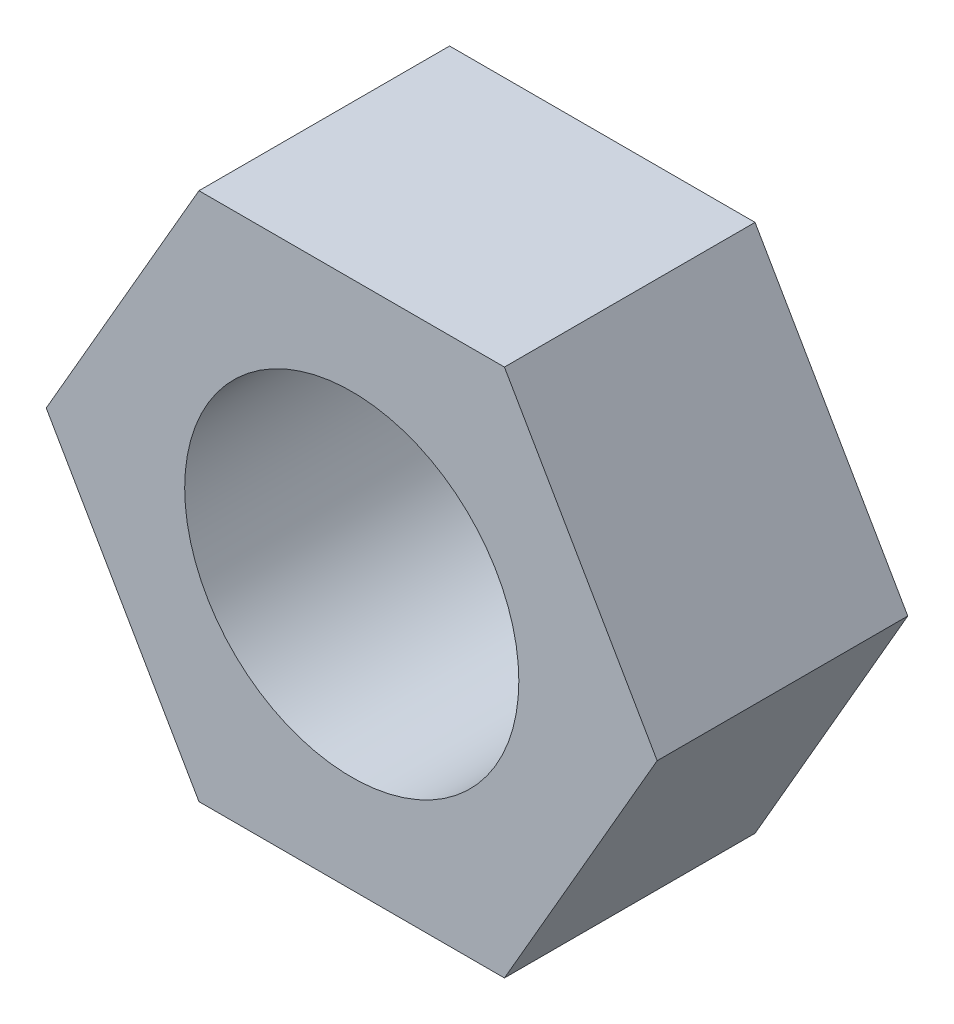
ISO-10303-21;
HEADER;
FILE_DESCRIPTION(('STEP AP214'),'2;1');
FILE_NAME('part.step','',(''),(''),'','','');
FILE_SCHEMA(('AUTOMOTIVE_DESIGN { 1 0 10303 214 1 1 1 1 }'));
ENDSEC;
DATA;
#1=APPLICATION_CONTEXT('core data for automotive mechanical design processes');
#2=APPLICATION_PROTOCOL_DEFINITION('international standard','automotive_design',2000,#1);
#3=PRODUCT_CONTEXT('',#1,'mechanical');
#4=PRODUCT('Part','Part','',(#3));
#5=PRODUCT_RELATED_PRODUCT_CATEGORY('part','',(#4));
#6=PRODUCT_DEFINITION_FORMATION('','',#4);
#7=PRODUCT_DEFINITION_CONTEXT('part definition',#1,'design');
#8=PRODUCT_DEFINITION('design','',#6,#7);
#9=PRODUCT_DEFINITION_SHAPE('','',#8);
#10=(LENGTH_UNIT() NAMED_UNIT(*) SI_UNIT(.MILLI.,.METRE.));
#11=(NAMED_UNIT(*) PLANE_ANGLE_UNIT() SI_UNIT($,.RADIAN.));
#12=(NAMED_UNIT(*) SI_UNIT($,.STERADIAN.) SOLID_ANGLE_UNIT());
#13=UNCERTAINTY_MEASURE_WITH_UNIT(LENGTH_MEASURE(1.E-05),#10,'distance_accuracy_value','');
#14=(GEOMETRIC_REPRESENTATION_CONTEXT(3) GLOBAL_UNCERTAINTY_ASSIGNED_CONTEXT((#13)) GLOBAL_UNIT_ASSIGNED_CONTEXT((#10,
#11,#12)) REPRESENTATION_CONTEXT('',''));
#15=CARTESIAN_POINT('',(0.,0.,0.));
#16=DIRECTION('',(0.,0.,1.));
#17=DIRECTION('',(1.,0.,0.));
#18=AXIS2_PLACEMENT_3D('',#15,#16,#17);
#19=CARTESIAN_POINT('',(-10.9696551146029,0.,9.));
#20=DIRECTION('',(0.866025403784438,0.500000000000001,0.));
#21=DIRECTION('',(-0.500000000000001,0.866025403784438,0.));
#22=AXIS2_PLACEMENT_3D('',#19,#20,#21);
#23=PLANE('',#22);
#24=DIRECTION('',(0.500000000000001,-0.866025403784438,0.));
#25=VECTOR('',#24,1.);
#26=CARTESIAN_POINT('',(-10.9696551146029,0.,0.));
#27=LINE('',#26,#25);
#28=CARTESIAN_POINT('',(-10.9696551146029,0.,0.));
#29=VERTEX_POINT('',#28);
#30=CARTESIAN_POINT('',(-5.48482755730144,-9.5,0.));
#31=VERTEX_POINT('',#30);
#32=EDGE_CURVE('E87',#29,#31,#27,.T.);
#33=ORIENTED_EDGE('',*,*,#32,.T.);
#34=DIRECTION('',(0.,0.,-1.));
#35=VECTOR('',#34,1.);
#36=CARTESIAN_POINT('',(-5.48482755730144,-9.5,9.));
#37=LINE('',#36,#35);
#38=CARTESIAN_POINT('',(-5.48482755730144,-9.5,9.));
#39=VERTEX_POINT('',#38);
#40=EDGE_CURVE('E11',#39,#31,#37,.T.);
#41=ORIENTED_EDGE('',*,*,#40,.F.);
#42=DIRECTION('',(0.500000000000001,-0.866025403784438,0.));
#43=VECTOR('',#42,1.);
#44=CARTESIAN_POINT('',(-10.9696551146029,0.,9.));
#45=LINE('',#44,#43);
#46=CARTESIAN_POINT('',(-10.9696551146029,0.,9.));
#47=VERTEX_POINT('',#46);
#48=EDGE_CURVE('E113',#47,#39,#45,.T.);
#49=ORIENTED_EDGE('',*,*,#48,.F.);
#50=DIRECTION('',(0.,0.,-1.));
#51=VECTOR('',#50,1.);
#52=CARTESIAN_POINT('',(-10.9696551146029,0.,9.));
#53=LINE('',#52,#51);
#54=EDGE_CURVE('E100',#47,#29,#53,.T.);
#55=ORIENTED_EDGE('',*,*,#54,.T.);
#56=EDGE_LOOP('',(#33,#41,#49,#55));
#57=FACE_BOUND('',#56,.T.);
#58=ADVANCED_FACE('F30',(#57),#23,.F.);
#59=CARTESIAN_POINT('',(5.48482755730145,-9.5,9.));
#60=DIRECTION('',(0.,1.,0.));
#61=DIRECTION('',(0.,0.,1.));
#62=AXIS2_PLACEMENT_3D('',#59,#60,#61);
#63=PLANE('',#62);
#64=DIRECTION('',(1.,0.,0.));
#65=VECTOR('',#64,1.);
#66=CARTESIAN_POINT('',(5.48482755730145,-9.5,0.));
#67=LINE('',#66,#65);
#68=CARTESIAN_POINT('',(5.48482755730145,-9.5,0.));
#69=VERTEX_POINT('',#68);
#70=EDGE_CURVE('E83',#31,#69,#67,.T.);
#71=ORIENTED_EDGE('',*,*,#70,.T.);
#72=DIRECTION('',(0.,0.,-1.));
#73=VECTOR('',#72,1.);
#74=CARTESIAN_POINT('',(5.48482755730145,-9.5,9.));
#75=LINE('',#74,#73);
#76=CARTESIAN_POINT('',(5.48482755730145,-9.5,9.));
#77=VERTEX_POINT('',#76);
#78=EDGE_CURVE('E38',#77,#69,#75,.T.);
#79=ORIENTED_EDGE('',*,*,#78,.F.);
#80=DIRECTION('',(1.,0.,0.));
#81=VECTOR('',#80,1.);
#82=CARTESIAN_POINT('',(5.48482755730145,-9.5,9.));
#83=LINE('',#82,#81);
#84=EDGE_CURVE('E96',#39,#77,#83,.T.);
#85=ORIENTED_EDGE('',*,*,#84,.F.);
#86=ORIENTED_EDGE('',*,*,#40,.T.);
#87=EDGE_LOOP('',(#71,#79,#85,#86));
#88=FACE_BOUND('',#87,.T.);
#89=ADVANCED_FACE('F95',(#88),#63,.F.);
#90=CARTESIAN_POINT('',(5.48482755730145,-9.5,9.));
#91=DIRECTION('',(-0.866025403784439,0.5,0.));
#92=DIRECTION('',(-0.5,-0.866025403784439,0.));
#93=AXIS2_PLACEMENT_3D('',#90,#91,#92);
#94=PLANE('',#93);
#95=DIRECTION('',(0.5,0.866025403784439,0.));
#96=VECTOR('',#95,1.);
#97=CARTESIAN_POINT('',(5.48482755730145,-9.5,0.));
#98=LINE('',#97,#96);
#99=CARTESIAN_POINT('',(10.9696551146029,0.,0.));
#100=VERTEX_POINT('',#99);
#101=EDGE_CURVE('E89',#69,#100,#98,.T.);
#102=ORIENTED_EDGE('',*,*,#101,.T.);
#103=DIRECTION('',(0.,0.,-1.));
#104=VECTOR('',#103,1.);
#105=CARTESIAN_POINT('',(10.9696551146029,0.,9.));
#106=LINE('',#105,#104);
#107=CARTESIAN_POINT('',(10.9696551146029,0.,9.));
#108=VERTEX_POINT('',#107);
#109=EDGE_CURVE('E129',#108,#100,#106,.T.);
#110=ORIENTED_EDGE('',*,*,#109,.F.);
#111=DIRECTION('',(0.5,0.866025403784439,0.));
#112=VECTOR('',#111,1.);
#113=CARTESIAN_POINT('',(5.48482755730145,-9.5,9.));
#114=LINE('',#113,#112);
#115=EDGE_CURVE('E116',#77,#108,#114,.T.);
#116=ORIENTED_EDGE('',*,*,#115,.F.);
#117=ORIENTED_EDGE('',*,*,#78,.T.);
#118=EDGE_LOOP('',(#102,#110,#116,#117));
#119=FACE_BOUND('',#118,.T.);
#120=ADVANCED_FACE('F134',(#119),#94,.F.);
#121=CARTESIAN_POINT('',(10.9696551146029,0.,9.));
#122=DIRECTION('',(-0.866025403784439,-0.5,0.));
#123=DIRECTION('',(0.5,-0.866025403784439,0.));
#124=AXIS2_PLACEMENT_3D('',#121,#122,#123);
#125=PLANE('',#124);
#126=DIRECTION('',(-0.5,0.866025403784438,0.));
#127=VECTOR('',#126,1.);
#128=CARTESIAN_POINT('',(10.9696551146029,0.,0.));
#129=LINE('',#128,#127);
#130=CARTESIAN_POINT('',(5.48482755730144,9.5,0.));
#131=VERTEX_POINT('',#130);
#132=EDGE_CURVE('E107',#100,#131,#129,.T.);
#133=ORIENTED_EDGE('',*,*,#132,.T.);
#134=DIRECTION('',(0.,0.,-1.));
#135=VECTOR('',#134,1.);
#136=CARTESIAN_POINT('',(5.48482755730144,9.5,9.));
#137=LINE('',#136,#135);
#138=CARTESIAN_POINT('',(5.48482755730144,9.5,9.));
#139=VERTEX_POINT('',#138);
#140=EDGE_CURVE('E126',#139,#131,#137,.T.);
#141=ORIENTED_EDGE('',*,*,#140,.F.);
#142=DIRECTION('',(-0.5,0.866025403784438,0.));
#143=VECTOR('',#142,1.);
#144=CARTESIAN_POINT('',(10.9696551146029,0.,9.));
#145=LINE('',#144,#143);
#146=EDGE_CURVE('E118',#108,#139,#145,.T.);
#147=ORIENTED_EDGE('',*,*,#146,.F.);
#148=ORIENTED_EDGE('',*,*,#109,.T.);
#149=EDGE_LOOP('',(#133,#141,#147,#148));
#150=FACE_BOUND('',#149,.T.);
#151=ADVANCED_FACE('F140',(#150),#125,.F.);
#152=CARTESIAN_POINT('',(-5.48482755730145,9.5,9.));
#153=DIRECTION('',(0.,-1.,0.));
#154=DIRECTION('',(0.,0.,-1.));
#155=AXIS2_PLACEMENT_3D('',#152,#153,#154);
#156=PLANE('',#155);
#157=DIRECTION('',(-1.,0.,0.));
#158=VECTOR('',#157,1.);
#159=CARTESIAN_POINT('',(-5.48482755730145,9.5,0.));
#160=LINE('',#159,#158);
#161=CARTESIAN_POINT('',(-5.48482755730145,9.5,0.));
#162=VERTEX_POINT('',#161);
#163=EDGE_CURVE('E109',#131,#162,#160,.T.);
#164=ORIENTED_EDGE('',*,*,#163,.T.);
#165=DIRECTION('',(0.,0.,-1.));
#166=VECTOR('',#165,1.);
#167=CARTESIAN_POINT('',(-5.48482755730145,9.5,9.));
#168=LINE('',#167,#166);
#169=CARTESIAN_POINT('',(-5.48482755730145,9.5,9.));
#170=VERTEX_POINT('',#169);
#171=EDGE_CURVE('E123',#170,#162,#168,.T.);
#172=ORIENTED_EDGE('',*,*,#171,.F.);
#173=DIRECTION('',(-1.,0.,0.));
#174=VECTOR('',#173,1.);
#175=CARTESIAN_POINT('',(-5.48482755730145,9.5,9.));
#176=LINE('',#175,#174);
#177=EDGE_CURVE('E50',#139,#170,#176,.T.);
#178=ORIENTED_EDGE('',*,*,#177,.F.);
#179=ORIENTED_EDGE('',*,*,#140,.T.);
#180=EDGE_LOOP('',(#164,#172,#178,#179));
#181=FACE_BOUND('',#180,.T.);
#182=ADVANCED_FACE('F143',(#181),#156,.F.);
#183=CARTESIAN_POINT('',(-5.48482755730145,9.5,9.));
#184=DIRECTION('',(0.866025403784439,-0.5,0.));
#185=DIRECTION('',(0.5,0.866025403784439,0.));
#186=AXIS2_PLACEMENT_3D('',#183,#184,#185);
#187=PLANE('',#186);
#188=DIRECTION('',(-0.5,-0.866025403784439,0.));
#189=VECTOR('',#188,1.);
#190=CARTESIAN_POINT('',(-5.48482755730145,9.5,0.));
#191=LINE('',#190,#189);
#192=EDGE_CURVE('E111',#162,#29,#191,.T.);
#193=ORIENTED_EDGE('',*,*,#192,.T.);
#194=ORIENTED_EDGE('',*,*,#54,.F.);
#195=DIRECTION('',(-0.5,-0.866025403784439,0.));
#196=VECTOR('',#195,1.);
#197=CARTESIAN_POINT('',(-5.48482755730145,9.5,9.));
#198=LINE('',#197,#196);
#199=EDGE_CURVE('E45',#170,#47,#198,.T.);
#200=ORIENTED_EDGE('',*,*,#199,.F.);
#201=ORIENTED_EDGE('',*,*,#171,.T.);
#202=EDGE_LOOP('',(#193,#194,#200,#201));
#203=FACE_BOUND('',#202,.T.);
#204=ADVANCED_FACE('F145',(#203),#187,.F.);
#205=CARTESIAN_POINT('',(-10.9696551146029,0.,9.));
#206=DIRECTION('',(0.,0.,-1.));
#207=DIRECTION('',(-1.,0.,0.));
#208=AXIS2_PLACEMENT_3D('',#205,#206,#207);
#209=PLANE('',#208);
#210=CARTESIAN_POINT('',(0.00252104699582575,0.,9.));
#211=DIRECTION('',(0.,0.,1.));
#212=DIRECTION('',(1.,0.,0.));
#213=AXIS2_PLACEMENT_3D('',#210,#211,#212);
#214=CIRCLE('',#213,6.);
#215=CARTESIAN_POINT('',(6.00252104699582,0.,9.));
#216=VERTEX_POINT('',#215);
#217=EDGE_CURVE('E103',#216,#216,#214,.T.);
#218=ORIENTED_EDGE('',*,*,#217,.F.);
#219=EDGE_LOOP('',(#218));
#220=FACE_BOUND('',#219,.T.);
#221=ORIENTED_EDGE('',*,*,#48,.T.);
#222=ORIENTED_EDGE('',*,*,#84,.T.);
#223=ORIENTED_EDGE('',*,*,#115,.T.);
#224=ORIENTED_EDGE('',*,*,#146,.T.);
#225=ORIENTED_EDGE('',*,*,#177,.T.);
#226=ORIENTED_EDGE('',*,*,#199,.T.);
#227=EDGE_LOOP('',(#221,#222,#223,#224,#225,#226));
#228=FACE_BOUND('',#227,.T.);
#229=ADVANCED_FACE('F137',(#220,#228),#209,.F.);
#230=CARTESIAN_POINT('',(-10.9696551146029,0.,0.));
#231=DIRECTION('',(0.,0.,-1.));
#232=DIRECTION('',(-1.,0.,0.));
#233=AXIS2_PLACEMENT_3D('',#230,#231,#232);
#234=PLANE('',#233);
#235=CARTESIAN_POINT('',(0.00252104699582575,0.,0.));
#236=DIRECTION('',(0.,0.,-1.));
#237=DIRECTION('',(-1.,0.,0.));
#238=AXIS2_PLACEMENT_3D('',#235,#236,#237);
#239=CIRCLE('',#238,6.);
#240=CARTESIAN_POINT('',(-5.99747895300417,0.,0.));
#241=VERTEX_POINT('',#240);
#242=EDGE_CURVE('E33',#241,#241,#239,.T.);
#243=ORIENTED_EDGE('',*,*,#242,.F.);
#244=EDGE_LOOP('',(#243));
#245=FACE_BOUND('',#244,.T.);
#246=ORIENTED_EDGE('',*,*,#32,.F.);
#247=ORIENTED_EDGE('',*,*,#192,.F.);
#248=ORIENTED_EDGE('',*,*,#163,.F.);
#249=ORIENTED_EDGE('',*,*,#132,.F.);
#250=ORIENTED_EDGE('',*,*,#101,.F.);
#251=ORIENTED_EDGE('',*,*,#70,.F.);
#252=EDGE_LOOP('',(#246,#247,#248,#249,#250,#251));
#253=FACE_BOUND('',#252,.T.);
#254=ADVANCED_FACE('F84',(#245,#253),#234,.T.);
#255=CARTESIAN_POINT('',(0.00252104699582575,0.,9.));
#256=DIRECTION('',(0.,0.,1.));
#257=DIRECTION('',(1.,0.,0.));
#258=AXIS2_PLACEMENT_3D('',#255,#256,#257);
#259=CYLINDRICAL_SURFACE('',#258,6.);
#260=ORIENTED_EDGE('',*,*,#242,.T.);
#261=EDGE_LOOP('',(#260));
#262=FACE_BOUND('',#261,.T.);
#263=ORIENTED_EDGE('',*,*,#217,.T.);
#264=EDGE_LOOP('',(#263));
#265=FACE_BOUND('',#264,.T.);
#266=ADVANCED_FACE('F192',(#262,#265),#259,.F.);
#267=CLOSED_SHELL('',(#58,#89,#120,#151,#182,#204,#229,#254,#266));
#268=MANIFOLD_SOLID_BREP('B2',#267);
#269=ADVANCED_BREP_SHAPE_REPRESENTATION('',(#18,#268),#14);
#270=SHAPE_DEFINITION_REPRESENTATION(#9,#269);
ENDSEC;
END-ISO-10303-21;
